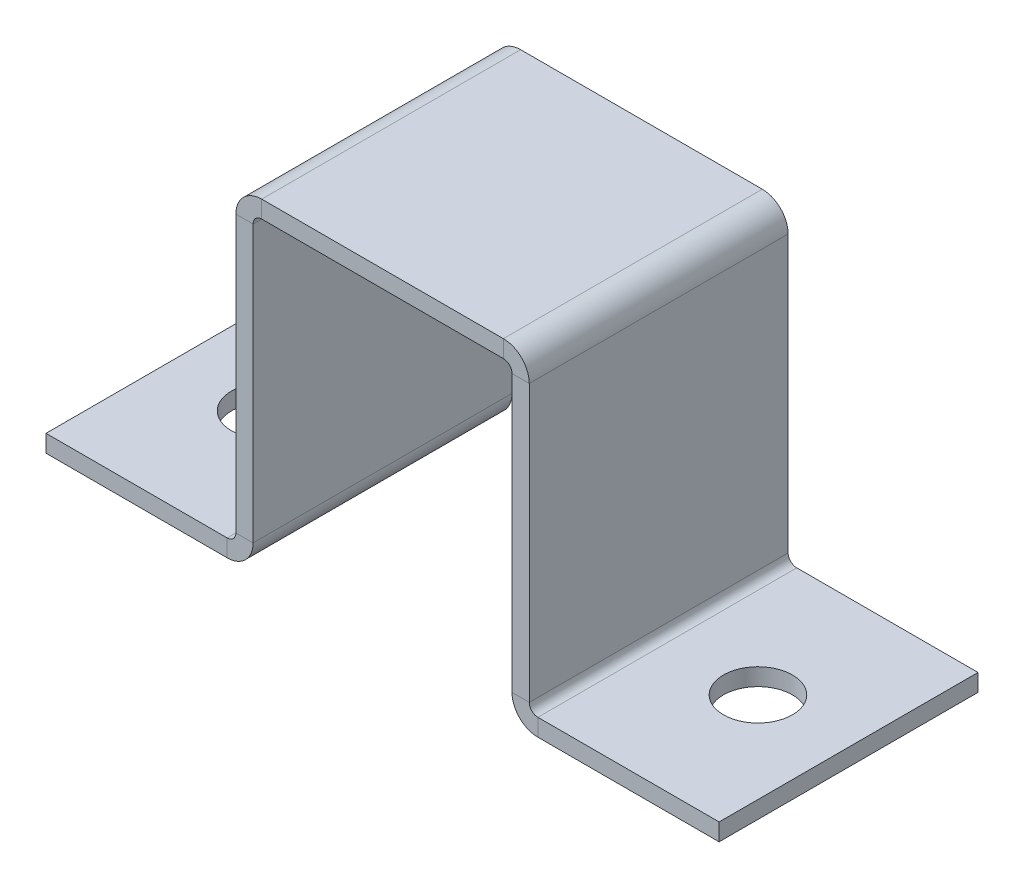
ISO-10303-21;
HEADER;
FILE_DESCRIPTION(('STEP AP214'),'2;1');
FILE_NAME('part.step','',(''),(''),'','','');
FILE_SCHEMA(('AUTOMOTIVE_DESIGN { 1 0 10303 214 1 1 1 1 }'));
ENDSEC;
DATA;
#1=APPLICATION_CONTEXT('core data for automotive mechanical design processes');
#2=APPLICATION_PROTOCOL_DEFINITION('international standard','automotive_design',2000,#1);
#3=PRODUCT_CONTEXT('',#1,'mechanical');
#4=PRODUCT('Part','Part','',(#3));
#5=PRODUCT_RELATED_PRODUCT_CATEGORY('part','',(#4));
#6=PRODUCT_DEFINITION_FORMATION('','',#4);
#7=PRODUCT_DEFINITION_CONTEXT('part definition',#1,'design');
#8=PRODUCT_DEFINITION('design','',#6,#7);
#9=PRODUCT_DEFINITION_SHAPE('','',#8);
#10=(LENGTH_UNIT() NAMED_UNIT(*) SI_UNIT(.MILLI.,.METRE.));
#11=(NAMED_UNIT(*) PLANE_ANGLE_UNIT() SI_UNIT($,.RADIAN.));
#12=(NAMED_UNIT(*) SI_UNIT($,.STERADIAN.) SOLID_ANGLE_UNIT());
#13=UNCERTAINTY_MEASURE_WITH_UNIT(LENGTH_MEASURE(1.E-05),#10,'distance_accuracy_value','');
#14=(GEOMETRIC_REPRESENTATION_CONTEXT(3) GLOBAL_UNCERTAINTY_ASSIGNED_CONTEXT((#13)) GLOBAL_UNIT_ASSIGNED_CONTEXT((#10,
#11,#12)) REPRESENTATION_CONTEXT('',''));
#15=CARTESIAN_POINT('',(0.,0.,0.));
#16=DIRECTION('',(0.,0.,1.));
#17=DIRECTION('',(1.,0.,0.));
#18=AXIS2_PLACEMENT_3D('',#15,#16,#17);
#19=CARTESIAN_POINT('',(-9.,0.,15.));
#20=DIRECTION('',(0.,0.,1.));
#21=DIRECTION('',(1.,0.,0.));
#22=AXIS2_PLACEMENT_3D('',#19,#20,#21);
#23=PLANE('',#22);
#24=DIRECTION('',(0.,1.,0.));
#25=VECTOR('',#24,1.);
#26=CARTESIAN_POINT('',(-9.,0.,15.));
#27=LINE('',#26,#25);
#28=CARTESIAN_POINT('',(-9.,0.,15.));
#29=VERTEX_POINT('',#28);
#30=CARTESIAN_POINT('',(-9.,1.,15.));
#31=VERTEX_POINT('',#30);
#32=EDGE_CURVE('E11',#29,#31,#27,.T.);
#33=ORIENTED_EDGE('',*,*,#32,.F.);
#34=CARTESIAN_POINT('',(-9.,1.5,15.));
#35=DIRECTION('',(0.,0.,-1.));
#36=DIRECTION('',(-1.,0.,0.));
#37=AXIS2_PLACEMENT_3D('',#34,#35,#36);
#38=CIRCLE('',#37,1.5);
#39=CARTESIAN_POINT('',(-7.5,1.5,15.));
#40=VERTEX_POINT('',#39);
#41=EDGE_CURVE('E366',#29,#40,#38,.F.);
#42=ORIENTED_EDGE('',*,*,#41,.T.);
#43=DIRECTION('',(1.,0.,0.));
#44=VECTOR('',#43,1.);
#45=CARTESIAN_POINT('',(-8.5,1.5,15.));
#46=LINE('',#45,#44);
#47=CARTESIAN_POINT('',(-8.5,1.5,15.));
#48=VERTEX_POINT('',#47);
#49=EDGE_CURVE('E47',#48,#40,#46,.T.);
#50=ORIENTED_EDGE('',*,*,#49,.F.);
#51=CARTESIAN_POINT('',(-9.,1.5,15.));
#52=DIRECTION('',(0.,0.,1.));
#53=DIRECTION('',(1.,0.,0.));
#54=AXIS2_PLACEMENT_3D('',#51,#52,#53);
#55=CIRCLE('',#54,0.5);
#56=EDGE_CURVE('E442',#31,#48,#55,.T.);
#57=ORIENTED_EDGE('',*,*,#56,.F.);
#58=EDGE_LOOP('',(#33,#42,#50,#57));
#59=FACE_BOUND('',#58,.T.);
#60=ADVANCED_FACE('F38',(#59),#23,.T.);
#61=CARTESIAN_POINT('',(-8.5,1.5,15.));
#62=DIRECTION('',(0.,0.,1.));
#63=DIRECTION('',(1.,0.,0.));
#64=AXIS2_PLACEMENT_3D('',#61,#62,#63);
#65=PLANE('',#64);
#66=DIRECTION('',(1.,0.,0.));
#67=VECTOR('',#66,1.);
#68=CARTESIAN_POINT('',(-19.5,0.,15.));
#69=LINE('',#68,#67);
#70=CARTESIAN_POINT('',(-19.5,0.,15.));
#71=VERTEX_POINT('',#70);
#72=EDGE_CURVE('E370',#71,#29,#69,.T.);
#73=ORIENTED_EDGE('',*,*,#72,.T.);
#74=ORIENTED_EDGE('',*,*,#32,.T.);
#75=DIRECTION('',(1.,0.,0.));
#76=VECTOR('',#75,1.);
#77=CARTESIAN_POINT('',(-19.5,1.,15.));
#78=LINE('',#77,#76);
#79=CARTESIAN_POINT('',(-19.5,1.,15.));
#80=VERTEX_POINT('',#79);
#81=EDGE_CURVE('E444',#80,#31,#78,.T.);
#82=ORIENTED_EDGE('',*,*,#81,.F.);
#83=DIRECTION('',(0.,1.,0.));
#84=VECTOR('',#83,1.);
#85=CARTESIAN_POINT('',(-19.5,0.,15.));
#86=LINE('',#85,#84);
#87=EDGE_CURVE('E447',#71,#80,#86,.T.);
#88=ORIENTED_EDGE('',*,*,#87,.F.);
#89=EDGE_LOOP('',(#73,#74,#82,#88));
#90=FACE_BOUND('',#89,.T.);
#91=ADVANCED_FACE('F453',(#90),#65,.T.);
#92=CARTESIAN_POINT('',(-7.5,1.5,0.));
#93=DIRECTION('',(0.,0.,-1.));
#94=DIRECTION('',(-1.,0.,0.));
#95=AXIS2_PLACEMENT_3D('',#92,#93,#94);
#96=PLANE('',#95);
#97=DIRECTION('',(-1.,0.,0.));
#98=VECTOR('',#97,1.);
#99=CARTESIAN_POINT('',(-7.5,1.5,0.));
#100=LINE('',#99,#98);
#101=CARTESIAN_POINT('',(-7.5,1.5,0.));
#102=VERTEX_POINT('',#101);
#103=CARTESIAN_POINT('',(-8.5,1.5,0.));
#104=VERTEX_POINT('',#103);
#105=EDGE_CURVE('E349',#102,#104,#100,.T.);
#106=ORIENTED_EDGE('',*,*,#105,.F.);
#107=CARTESIAN_POINT('',(-9.,1.5,0.));
#108=DIRECTION('',(0.,0.,-1.));
#109=DIRECTION('',(-1.,0.,0.));
#110=AXIS2_PLACEMENT_3D('',#107,#108,#109);
#111=CIRCLE('',#110,1.5);
#112=CARTESIAN_POINT('',(-9.,0.,0.));
#113=VERTEX_POINT('',#112);
#114=EDGE_CURVE('E265',#113,#102,#111,.F.);
#115=ORIENTED_EDGE('',*,*,#114,.F.);
#116=DIRECTION('',(0.,-1.,0.));
#117=VECTOR('',#116,1.);
#118=CARTESIAN_POINT('',(-9.,1.,0.));
#119=LINE('',#118,#117);
#120=CARTESIAN_POINT('',(-9.,1.,0.));
#121=VERTEX_POINT('',#120);
#122=EDGE_CURVE('E347',#121,#113,#119,.T.);
#123=ORIENTED_EDGE('',*,*,#122,.F.);
#124=CARTESIAN_POINT('',(-9.,1.5,0.));
#125=DIRECTION('',(0.,0.,1.));
#126=DIRECTION('',(1.,0.,0.));
#127=AXIS2_PLACEMENT_3D('',#124,#125,#126);
#128=CIRCLE('',#127,0.5);
#129=EDGE_CURVE('E253',#121,#104,#128,.T.);
#130=ORIENTED_EDGE('',*,*,#129,.T.);
#131=EDGE_LOOP('',(#106,#115,#123,#130));
#132=FACE_BOUND('',#131,.T.);
#133=ADVANCED_FACE('F460',(#132),#96,.T.);
#134=CARTESIAN_POINT('',(-9.,1.,0.));
#135=DIRECTION('',(0.,0.,-1.));
#136=DIRECTION('',(-1.,0.,0.));
#137=AXIS2_PLACEMENT_3D('',#134,#135,#136);
#138=PLANE('',#137);
#139=DIRECTION('',(0.,1.,0.));
#140=VECTOR('',#139,1.);
#141=CARTESIAN_POINT('',(-7.5,0.,0.));
#142=LINE('',#141,#140);
#143=CARTESIAN_POINT('',(-7.5,17.5,0.));
#144=VERTEX_POINT('',#143);
#145=EDGE_CURVE('E268',#102,#144,#142,.T.);
#146=ORIENTED_EDGE('',*,*,#145,.F.);
#147=ORIENTED_EDGE('',*,*,#105,.T.);
#148=DIRECTION('',(0.,1.,0.));
#149=VECTOR('',#148,1.);
#150=CARTESIAN_POINT('',(-8.5,0.,0.));
#151=LINE('',#150,#149);
#152=CARTESIAN_POINT('',(-8.5,17.5,0.));
#153=VERTEX_POINT('',#152);
#154=EDGE_CURVE('E250',#104,#153,#151,.T.);
#155=ORIENTED_EDGE('',*,*,#154,.T.);
#156=DIRECTION('',(1.,0.,0.));
#157=VECTOR('',#156,1.);
#158=CARTESIAN_POINT('',(-8.5,17.5,0.));
#159=LINE('',#158,#157);
#160=EDGE_CURVE('E339',#153,#144,#159,.T.);
#161=ORIENTED_EDGE('',*,*,#160,.T.);
#162=EDGE_LOOP('',(#146,#147,#155,#161));
#163=FACE_BOUND('',#162,.T.);
#164=ADVANCED_FACE('F463',(#163),#138,.T.);
#165=CARTESIAN_POINT('',(-7.5,17.5,15.));
#166=DIRECTION('',(0.,0.,1.));
#167=DIRECTION('',(1.,0.,0.));
#168=AXIS2_PLACEMENT_3D('',#165,#166,#167);
#169=PLANE('',#168);
#170=DIRECTION('',(-1.,0.,0.));
#171=VECTOR('',#170,1.);
#172=CARTESIAN_POINT('',(-7.5,17.5,15.));
#173=LINE('',#172,#171);
#174=CARTESIAN_POINT('',(-7.5,17.5,15.));
#175=VERTEX_POINT('',#174);
#176=CARTESIAN_POINT('',(-8.5,17.5,15.));
#177=VERTEX_POINT('',#176);
#178=EDGE_CURVE('E345',#175,#177,#173,.T.);
#179=ORIENTED_EDGE('',*,*,#178,.F.);
#180=CARTESIAN_POINT('',(-7.,17.5,15.));
#181=DIRECTION('',(0.,0.,1.));
#182=DIRECTION('',(1.,0.,0.));
#183=AXIS2_PLACEMENT_3D('',#180,#181,#182);
#184=CIRCLE('',#183,0.5);
#185=CARTESIAN_POINT('',(-7.,18.,15.));
#186=VERTEX_POINT('',#185);
#187=EDGE_CURVE('E378',#175,#186,#184,.F.);
#188=ORIENTED_EDGE('',*,*,#187,.T.);
#189=DIRECTION('',(0.,-1.,0.));
#190=VECTOR('',#189,1.);
#191=CARTESIAN_POINT('',(-7.,19.,15.));
#192=LINE('',#191,#190);
#193=CARTESIAN_POINT('',(-7.,19.,15.));
#194=VERTEX_POINT('',#193);
#195=EDGE_CURVE('E343',#194,#186,#192,.T.);
#196=ORIENTED_EDGE('',*,*,#195,.F.);
#197=CARTESIAN_POINT('',(-7.,17.5,15.));
#198=DIRECTION('',(0.,0.,1.));
#199=DIRECTION('',(1.,0.,0.));
#200=AXIS2_PLACEMENT_3D('',#197,#198,#199);
#201=CIRCLE('',#200,1.5);
#202=EDGE_CURVE('E438',#177,#194,#201,.F.);
#203=ORIENTED_EDGE('',*,*,#202,.F.);
#204=EDGE_LOOP('',(#179,#188,#196,#203));
#205=FACE_BOUND('',#204,.T.);
#206=ADVANCED_FACE('F483',(#205),#169,.T.);
#207=CARTESIAN_POINT('',(-7.,19.,15.));
#208=DIRECTION('',(0.,0.,1.));
#209=DIRECTION('',(1.,0.,0.));
#210=AXIS2_PLACEMENT_3D('',#207,#208,#209);
#211=PLANE('',#210);
#212=DIRECTION('',(0.,1.,0.));
#213=VECTOR('',#212,1.);
#214=CARTESIAN_POINT('',(-7.5,0.,15.));
#215=LINE('',#214,#213);
#216=EDGE_CURVE('E357',#40,#175,#215,.T.);
#217=ORIENTED_EDGE('',*,*,#216,.T.);
#218=ORIENTED_EDGE('',*,*,#178,.T.);
#219=DIRECTION('',(0.,1.,0.));
#220=VECTOR('',#219,1.);
#221=CARTESIAN_POINT('',(-8.5,0.,15.));
#222=LINE('',#221,#220);
#223=EDGE_CURVE('E360',#48,#177,#222,.T.);
#224=ORIENTED_EDGE('',*,*,#223,.F.);
#225=ORIENTED_EDGE('',*,*,#49,.T.);
#226=EDGE_LOOP('',(#217,#218,#224,#225));
#227=FACE_BOUND('',#226,.T.);
#228=ADVANCED_FACE('F355',(#227),#211,.T.);
#229=CARTESIAN_POINT('',(-7.,18.,0.));
#230=DIRECTION('',(0.,0.,-1.));
#231=DIRECTION('',(-1.,0.,0.));
#232=AXIS2_PLACEMENT_3D('',#229,#230,#231);
#233=PLANE('',#232);
#234=DIRECTION('',(0.,1.,0.));
#235=VECTOR('',#234,1.);
#236=CARTESIAN_POINT('',(-7.,18.,0.));
#237=LINE('',#236,#235);
#238=CARTESIAN_POINT('',(-7.,18.,0.));
#239=VERTEX_POINT('',#238);
#240=CARTESIAN_POINT('',(-7.,19.,0.));
#241=VERTEX_POINT('',#240);
#242=EDGE_CURVE('E341',#239,#241,#237,.T.);
#243=ORIENTED_EDGE('',*,*,#242,.F.);
#244=CARTESIAN_POINT('',(-7.,17.5,0.));
#245=DIRECTION('',(0.,0.,1.));
#246=DIRECTION('',(1.,0.,0.));
#247=AXIS2_PLACEMENT_3D('',#244,#245,#246);
#248=CIRCLE('',#247,0.5);
#249=EDGE_CURVE('E271',#144,#239,#248,.F.);
#250=ORIENTED_EDGE('',*,*,#249,.F.);
#251=ORIENTED_EDGE('',*,*,#160,.F.);
#252=CARTESIAN_POINT('',(-7.,17.5,0.));
#253=DIRECTION('',(0.,0.,1.));
#254=DIRECTION('',(1.,0.,0.));
#255=AXIS2_PLACEMENT_3D('',#252,#253,#254);
#256=CIRCLE('',#255,1.5);
#257=EDGE_CURVE('E247',#153,#241,#256,.F.);
#258=ORIENTED_EDGE('',*,*,#257,.T.);
#259=EDGE_LOOP('',(#243,#250,#251,#258));
#260=FACE_BOUND('',#259,.T.);
#261=ADVANCED_FACE('F477',(#260),#233,.T.);
#262=CARTESIAN_POINT('',(-8.5,17.5,0.));
#263=DIRECTION('',(0.,0.,-1.));
#264=DIRECTION('',(-1.,0.,0.));
#265=AXIS2_PLACEMENT_3D('',#262,#263,#264);
#266=PLANE('',#265);
#267=DIRECTION('',(1.,0.,0.));
#268=VECTOR('',#267,1.);
#269=CARTESIAN_POINT('',(-7.5,18.,0.));
#270=LINE('',#269,#268);
#271=CARTESIAN_POINT('',(6.99999999999999,18.,0.));
#272=VERTEX_POINT('',#271);
#273=EDGE_CURVE('E274',#239,#272,#270,.T.);
#274=ORIENTED_EDGE('',*,*,#273,.F.);
#275=ORIENTED_EDGE('',*,*,#242,.T.);
#276=DIRECTION('',(1.,0.,0.));
#277=VECTOR('',#276,1.);
#278=CARTESIAN_POINT('',(-7.5,19.,0.));
#279=LINE('',#278,#277);
#280=CARTESIAN_POINT('',(6.99999999999998,19.,0.));
#281=VERTEX_POINT('',#280);
#282=EDGE_CURVE('E244',#241,#281,#279,.T.);
#283=ORIENTED_EDGE('',*,*,#282,.T.);
#284=DIRECTION('',(0.,-1.,0.));
#285=VECTOR('',#284,1.);
#286=CARTESIAN_POINT('',(6.99999999999998,19.,0.));
#287=LINE('',#286,#285);
#288=EDGE_CURVE('E335',#281,#272,#287,.T.);
#289=ORIENTED_EDGE('',*,*,#288,.T.);
#290=EDGE_LOOP('',(#274,#275,#283,#289));
#291=FACE_BOUND('',#290,.T.);
#292=ADVANCED_FACE('F487',(#291),#266,.T.);
#293=CARTESIAN_POINT('',(6.99999999999999,18.,15.));
#294=DIRECTION('',(0.,0.,1.));
#295=DIRECTION('',(1.,0.,0.));
#296=AXIS2_PLACEMENT_3D('',#293,#294,#295);
#297=PLANE('',#296);
#298=DIRECTION('',(0.,1.,0.));
#299=VECTOR('',#298,1.);
#300=CARTESIAN_POINT('',(6.99999999999999,18.,15.));
#301=LINE('',#300,#299);
#302=CARTESIAN_POINT('',(6.99999999999999,18.,15.));
#303=VERTEX_POINT('',#302);
#304=CARTESIAN_POINT('',(6.99999999999998,19.,15.));
#305=VERTEX_POINT('',#304);
#306=EDGE_CURVE('E196',#303,#305,#301,.T.);
#307=ORIENTED_EDGE('',*,*,#306,.F.);
#308=CARTESIAN_POINT('',(7.,17.5,15.));
#309=DIRECTION('',(0.,0.,1.));
#310=DIRECTION('',(1.,0.,0.));
#311=AXIS2_PLACEMENT_3D('',#308,#309,#310);
#312=CIRCLE('',#311,0.5);
#313=CARTESIAN_POINT('',(7.5,17.5,15.));
#314=VERTEX_POINT('',#313);
#315=EDGE_CURVE('E200',#303,#314,#312,.F.);
#316=ORIENTED_EDGE('',*,*,#315,.T.);
#317=DIRECTION('',(-1.,0.,0.));
#318=VECTOR('',#317,1.);
#319=CARTESIAN_POINT('',(8.5,17.5,15.));
#320=LINE('',#319,#318);
#321=CARTESIAN_POINT('',(8.5,17.5,15.));
#322=VERTEX_POINT('',#321);
#323=EDGE_CURVE('E184',#322,#314,#320,.T.);
#324=ORIENTED_EDGE('',*,*,#323,.F.);
#325=CARTESIAN_POINT('',(7.,17.5,15.));
#326=DIRECTION('',(0.,0.,1.));
#327=DIRECTION('',(1.,0.,0.));
#328=AXIS2_PLACEMENT_3D('',#325,#326,#327);
#329=CIRCLE('',#328,1.5);
#330=EDGE_CURVE('E399',#305,#322,#329,.F.);
#331=ORIENTED_EDGE('',*,*,#330,.F.);
#332=EDGE_LOOP('',(#307,#316,#324,#331));
#333=FACE_BOUND('',#332,.T.);
#334=ADVANCED_FACE('F202',(#333),#297,.T.);
#335=CARTESIAN_POINT('',(8.5,17.5,15.));
#336=DIRECTION('',(0.,0.,1.));
#337=DIRECTION('',(1.,0.,0.));
#338=AXIS2_PLACEMENT_3D('',#335,#336,#337);
#339=PLANE('',#338);
#340=DIRECTION('',(1.,0.,0.));
#341=VECTOR('',#340,1.);
#342=CARTESIAN_POINT('',(-7.5,18.,15.));
#343=LINE('',#342,#341);
#344=EDGE_CURVE('E206',#186,#303,#343,.T.);
#345=ORIENTED_EDGE('',*,*,#344,.T.);
#346=ORIENTED_EDGE('',*,*,#306,.T.);
#347=DIRECTION('',(1.,0.,0.));
#348=VECTOR('',#347,1.);
#349=CARTESIAN_POINT('',(-7.5,19.,15.));
#350=LINE('',#349,#348);
#351=EDGE_CURVE('E435',#194,#305,#350,.T.);
#352=ORIENTED_EDGE('',*,*,#351,.F.);
#353=ORIENTED_EDGE('',*,*,#195,.T.);
#354=EDGE_LOOP('',(#345,#346,#352,#353));
#355=FACE_BOUND('',#354,.T.);
#356=ADVANCED_FACE('F386',(#355),#339,.T.);
#357=CARTESIAN_POINT('',(7.5,17.5,0.));
#358=DIRECTION('',(0.,0.,-1.));
#359=DIRECTION('',(-1.,0.,0.));
#360=AXIS2_PLACEMENT_3D('',#357,#358,#359);
#361=PLANE('',#360);
#362=DIRECTION('',(1.,0.,0.));
#363=VECTOR('',#362,1.);
#364=CARTESIAN_POINT('',(7.5,17.5,0.));
#365=LINE('',#364,#363);
#366=CARTESIAN_POINT('',(7.5,17.5,0.));
#367=VERTEX_POINT('',#366);
#368=CARTESIAN_POINT('',(8.5,17.5,0.));
#369=VERTEX_POINT('',#368);
#370=EDGE_CURVE('E197',#367,#369,#365,.T.);
#371=ORIENTED_EDGE('',*,*,#370,.F.);
#372=CARTESIAN_POINT('',(7.,17.5,0.));
#373=DIRECTION('',(0.,0.,1.));
#374=DIRECTION('',(1.,0.,0.));
#375=AXIS2_PLACEMENT_3D('',#372,#373,#374);
#376=CIRCLE('',#375,0.5);
#377=EDGE_CURVE('E213',#272,#367,#376,.F.);
#378=ORIENTED_EDGE('',*,*,#377,.F.);
#379=ORIENTED_EDGE('',*,*,#288,.F.);
#380=CARTESIAN_POINT('',(7.,17.5,0.));
#381=DIRECTION('',(0.,0.,1.));
#382=DIRECTION('',(1.,0.,0.));
#383=AXIS2_PLACEMENT_3D('',#380,#381,#382);
#384=CIRCLE('',#383,1.5);
#385=EDGE_CURVE('E241',#281,#369,#384,.F.);
#386=ORIENTED_EDGE('',*,*,#385,.T.);
#387=EDGE_LOOP('',(#371,#378,#379,#386));
#388=FACE_BOUND('',#387,.T.);
#389=ADVANCED_FACE('F393',(#388),#361,.T.);
#390=CARTESIAN_POINT('',(6.99999999999998,19.,0.));
#391=DIRECTION('',(0.,0.,-1.));
#392=DIRECTION('',(-1.,0.,0.));
#393=AXIS2_PLACEMENT_3D('',#390,#391,#392);
#394=PLANE('',#393);
#395=DIRECTION('',(0.,-1.,0.));
#396=VECTOR('',#395,1.);
#397=CARTESIAN_POINT('',(7.5,18.,0.));
#398=LINE('',#397,#396);
#399=CARTESIAN_POINT('',(7.5,1.5,0.));
#400=VERTEX_POINT('',#399);
#401=EDGE_CURVE('E278',#367,#400,#398,.T.);
#402=ORIENTED_EDGE('',*,*,#401,.F.);
#403=ORIENTED_EDGE('',*,*,#370,.T.);
#404=DIRECTION('',(0.,1.,0.));
#405=VECTOR('',#404,1.);
#406=CARTESIAN_POINT('',(8.5,18.,0.));
#407=LINE('',#406,#405);
#408=CARTESIAN_POINT('',(8.5,1.5,0.));
#409=VERTEX_POINT('',#408);
#410=EDGE_CURVE('E239',#369,#409,#407,.F.);
#411=ORIENTED_EDGE('',*,*,#410,.T.);
#412=DIRECTION('',(-1.,0.,0.));
#413=VECTOR('',#412,1.);
#414=CARTESIAN_POINT('',(8.5,1.5,0.));
#415=LINE('',#414,#413);
#416=EDGE_CURVE('E120',#409,#400,#415,.T.);
#417=ORIENTED_EDGE('',*,*,#416,.T.);
#418=EDGE_LOOP('',(#402,#403,#411,#417));
#419=FACE_BOUND('',#418,.T.);
#420=ADVANCED_FACE('F395',(#419),#394,.T.);
#421=CARTESIAN_POINT('',(7.5,1.5,15.));
#422=DIRECTION('',(0.,0.,1.));
#423=DIRECTION('',(1.,0.,0.));
#424=AXIS2_PLACEMENT_3D('',#421,#422,#423);
#425=PLANE('',#424);
#426=DIRECTION('',(1.,0.,0.));
#427=VECTOR('',#426,1.);
#428=CARTESIAN_POINT('',(7.5,1.5,15.));
#429=LINE('',#428,#427);
#430=CARTESIAN_POINT('',(7.5,1.5,15.));
#431=VERTEX_POINT('',#430);
#432=CARTESIAN_POINT('',(8.5,1.5,15.));
#433=VERTEX_POINT('',#432);
#434=EDGE_CURVE('E333',#431,#433,#429,.T.);
#435=ORIENTED_EDGE('',*,*,#434,.F.);
#436=CARTESIAN_POINT('',(9.,1.5,15.));
#437=DIRECTION('',(0.,0.,-1.));
#438=DIRECTION('',(-1.,0.,0.));
#439=AXIS2_PLACEMENT_3D('',#436,#437,#438);
#440=CIRCLE('',#439,1.5);
#441=CARTESIAN_POINT('',(9.,0.,15.));
#442=VERTEX_POINT('',#441);
#443=EDGE_CURVE('E221',#431,#442,#440,.F.);
#444=ORIENTED_EDGE('',*,*,#443,.T.);
#445=DIRECTION('',(0.,-1.,0.));
#446=VECTOR('',#445,1.);
#447=CARTESIAN_POINT('',(9.,1.,15.));
#448=LINE('',#447,#446);
#449=CARTESIAN_POINT('',(9.,1.,15.));
#450=VERTEX_POINT('',#449);
#451=EDGE_CURVE('E55',#450,#442,#448,.T.);
#452=ORIENTED_EDGE('',*,*,#451,.F.);
#453=CARTESIAN_POINT('',(9.,1.5,15.));
#454=DIRECTION('',(0.,0.,1.));
#455=DIRECTION('',(1.,0.,0.));
#456=AXIS2_PLACEMENT_3D('',#453,#454,#455);
#457=CIRCLE('',#456,0.5);
#458=EDGE_CURVE('E427',#433,#450,#457,.T.);
#459=ORIENTED_EDGE('',*,*,#458,.F.);
#460=EDGE_LOOP('',(#435,#444,#452,#459));
#461=FACE_BOUND('',#460,.T.);
#462=ADVANCED_FACE('F558',(#461),#425,.T.);
#463=CARTESIAN_POINT('',(9.,1.,15.));
#464=DIRECTION('',(0.,0.,1.));
#465=DIRECTION('',(1.,0.,0.));
#466=AXIS2_PLACEMENT_3D('',#463,#464,#465);
#467=PLANE('',#466);
#468=DIRECTION('',(0.,-1.,0.));
#469=VECTOR('',#468,1.);
#470=CARTESIAN_POINT('',(7.5,18.,15.));
#471=LINE('',#470,#469);
#472=EDGE_CURVE('E188',#314,#431,#471,.T.);
#473=ORIENTED_EDGE('',*,*,#472,.T.);
#474=ORIENTED_EDGE('',*,*,#434,.T.);
#475=DIRECTION('',(0.,1.,0.));
#476=VECTOR('',#475,1.);
#477=CARTESIAN_POINT('',(8.5,18.,15.));
#478=LINE('',#477,#476);
#479=EDGE_CURVE('E191',#322,#433,#478,.F.);
#480=ORIENTED_EDGE('',*,*,#479,.F.);
#481=ORIENTED_EDGE('',*,*,#323,.T.);
#482=EDGE_LOOP('',(#473,#474,#480,#481));
#483=FACE_BOUND('',#482,.T.);
#484=ADVANCED_FACE('F186',(#483),#467,.T.);
#485=CARTESIAN_POINT('',(9.,0.,0.));
#486=DIRECTION('',(0.,0.,-1.));
#487=DIRECTION('',(-1.,0.,0.));
#488=AXIS2_PLACEMENT_3D('',#485,#486,#487);
#489=PLANE('',#488);
#490=DIRECTION('',(0.,1.,0.));
#491=VECTOR('',#490,1.);
#492=CARTESIAN_POINT('',(9.,0.,0.));
#493=LINE('',#492,#491);
#494=CARTESIAN_POINT('',(9.,0.,0.));
#495=VERTEX_POINT('',#494);
#496=CARTESIAN_POINT('',(9.,1.,0.));
#497=VERTEX_POINT('',#496);
#498=EDGE_CURVE('E127',#495,#497,#493,.T.);
#499=ORIENTED_EDGE('',*,*,#498,.F.);
#500=CARTESIAN_POINT('',(9.,1.5,0.));
#501=DIRECTION('',(0.,0.,-1.));
#502=DIRECTION('',(-1.,0.,0.));
#503=AXIS2_PLACEMENT_3D('',#500,#501,#502);
#504=CIRCLE('',#503,1.5);
#505=EDGE_CURVE('E280',#400,#495,#504,.F.);
#506=ORIENTED_EDGE('',*,*,#505,.F.);
#507=ORIENTED_EDGE('',*,*,#416,.F.);
#508=CARTESIAN_POINT('',(9.,1.5,0.));
#509=DIRECTION('',(0.,0.,1.));
#510=DIRECTION('',(1.,0.,0.));
#511=AXIS2_PLACEMENT_3D('',#508,#509,#510);
#512=CIRCLE('',#511,0.5);
#513=EDGE_CURVE('E237',#409,#497,#512,.T.);
#514=ORIENTED_EDGE('',*,*,#513,.T.);
#515=EDGE_LOOP('',(#499,#506,#507,#514));
#516=FACE_BOUND('',#515,.T.);
#517=ADVANCED_FACE('F410',(#516),#489,.T.);
#518=CARTESIAN_POINT('',(8.5,1.5,0.));
#519=DIRECTION('',(0.,0.,-1.));
#520=DIRECTION('',(-1.,0.,0.));
#521=AXIS2_PLACEMENT_3D('',#518,#519,#520);
#522=PLANE('',#521);
#523=DIRECTION('',(1.,0.,0.));
#524=VECTOR('',#523,1.);
#525=CARTESIAN_POINT('',(7.5,0.,0.));
#526=LINE('',#525,#524);
#527=CARTESIAN_POINT('',(19.5,0.,0.));
#528=VERTEX_POINT('',#527);
#529=EDGE_CURVE('E227',#495,#528,#526,.T.);
#530=ORIENTED_EDGE('',*,*,#529,.F.);
#531=ORIENTED_EDGE('',*,*,#498,.T.);
#532=DIRECTION('',(1.,0.,0.));
#533=VECTOR('',#532,1.);
#534=CARTESIAN_POINT('',(7.5,1.,0.));
#535=LINE('',#534,#533);
#536=CARTESIAN_POINT('',(19.5,1.,0.));
#537=VERTEX_POINT('',#536);
#538=EDGE_CURVE('E234',#497,#537,#535,.T.);
#539=ORIENTED_EDGE('',*,*,#538,.T.);
#540=DIRECTION('',(0.,-1.,0.));
#541=VECTOR('',#540,1.);
#542=CARTESIAN_POINT('',(19.5,1.,0.));
#543=LINE('',#542,#541);
#544=EDGE_CURVE('E230',#537,#528,#543,.T.);
#545=ORIENTED_EDGE('',*,*,#544,.T.);
#546=EDGE_LOOP('',(#530,#531,#539,#545));
#547=FACE_BOUND('',#546,.T.);
#548=ADVANCED_FACE('F418',(#547),#522,.T.);
#549=CARTESIAN_POINT('',(7.5,0.,15.));
#550=DIRECTION('',(0.,1.,0.));
#551=DIRECTION('',(0.,0.,1.));
#552=AXIS2_PLACEMENT_3D('',#549,#550,#551);
#553=PLANE('',#552);
#554=CARTESIAN_POINT('',(14.25,0.,7.5));
#555=DIRECTION('',(0.,1.,0.));
#556=DIRECTION('',(0.,0.,1.));
#557=AXIS2_PLACEMENT_3D('',#554,#555,#556);
#558=CIRCLE('',#557,2.);
#559=CARTESIAN_POINT('',(14.25,0.,9.5));
#560=VERTEX_POINT('',#559);
#561=EDGE_CURVE('E231',#560,#560,#558,.T.);
#562=ORIENTED_EDGE('',*,*,#561,.T.);
#563=EDGE_LOOP('',(#562));
#564=FACE_BOUND('',#563,.T.);
#565=ORIENTED_EDGE('',*,*,#529,.T.);
#566=DIRECTION('',(0.,0.,-1.));
#567=VECTOR('',#566,1.);
#568=CARTESIAN_POINT('',(19.5,0.,15.));
#569=LINE('',#568,#567);
#570=CARTESIAN_POINT('',(19.5,0.,15.));
#571=VERTEX_POINT('',#570);
#572=EDGE_CURVE('E328',#571,#528,#569,.T.);
#573=ORIENTED_EDGE('',*,*,#572,.F.);
#574=DIRECTION('',(1.,0.,0.));
#575=VECTOR('',#574,1.);
#576=CARTESIAN_POINT('',(7.5,0.,15.));
#577=LINE('',#576,#575);
#578=EDGE_CURVE('E133',#442,#571,#577,.T.);
#579=ORIENTED_EDGE('',*,*,#578,.F.);
#580=DIRECTION('',(0.,0.,-1.));
#581=VECTOR('',#580,1.);
#582=CARTESIAN_POINT('',(9.,0.,15.));
#583=LINE('',#582,#581);
#584=EDGE_CURVE('E223',#442,#495,#583,.T.);
#585=ORIENTED_EDGE('',*,*,#584,.T.);
#586=EDGE_LOOP('',(#565,#573,#579,#585));
#587=FACE_BOUND('',#586,.T.);
#588=ADVANCED_FACE('F416',(#564,#587),#553,.F.);
#589=CARTESIAN_POINT('',(19.5,1.,15.));
#590=DIRECTION('',(1.,0.,0.));
#591=DIRECTION('',(0.,0.,-1.));
#592=AXIS2_PLACEMENT_3D('',#589,#590,#591);
#593=PLANE('',#592);
#594=ORIENTED_EDGE('',*,*,#544,.F.);
#595=DIRECTION('',(0.,0.,-1.));
#596=VECTOR('',#595,1.);
#597=CARTESIAN_POINT('',(19.5,1.,15.));
#598=LINE('',#597,#596);
#599=CARTESIAN_POINT('',(19.5,1.,15.));
#600=VERTEX_POINT('',#599);
#601=EDGE_CURVE('E326',#600,#537,#598,.T.);
#602=ORIENTED_EDGE('',*,*,#601,.F.);
#603=DIRECTION('',(0.,-1.,0.));
#604=VECTOR('',#603,1.);
#605=CARTESIAN_POINT('',(19.5,1.,15.));
#606=LINE('',#605,#604);
#607=EDGE_CURVE('E423',#600,#571,#606,.T.);
#608=ORIENTED_EDGE('',*,*,#607,.T.);
#609=ORIENTED_EDGE('',*,*,#572,.T.);
#610=EDGE_LOOP('',(#594,#602,#608,#609));
#611=FACE_BOUND('',#610,.T.);
#612=ADVANCED_FACE('F421',(#611),#593,.T.);
#613=CARTESIAN_POINT('',(7.5,1.,15.));
#614=DIRECTION('',(0.,1.,0.));
#615=DIRECTION('',(0.,0.,1.));
#616=AXIS2_PLACEMENT_3D('',#613,#614,#615);
#617=PLANE('',#616);
#618=CARTESIAN_POINT('',(14.25,1.,7.5));
#619=DIRECTION('',(0.,1.,0.));
#620=DIRECTION('',(0.,0.,1.));
#621=AXIS2_PLACEMENT_3D('',#618,#619,#620);
#622=CIRCLE('',#621,2.);
#623=CARTESIAN_POINT('',(14.25,1.,9.5));
#624=VERTEX_POINT('',#623);
#625=EDGE_CURVE('E906',#624,#624,#622,.T.);
#626=ORIENTED_EDGE('',*,*,#625,.F.);
#627=EDGE_LOOP('',(#626));
#628=FACE_BOUND('',#627,.T.);
#629=ORIENTED_EDGE('',*,*,#538,.F.);
#630=DIRECTION('',(0.,0.,-1.));
#631=VECTOR('',#630,1.);
#632=CARTESIAN_POINT('',(9.,1.,15.));
#633=LINE('',#632,#631);
#634=EDGE_CURVE('E323',#450,#497,#633,.T.);
#635=ORIENTED_EDGE('',*,*,#634,.F.);
#636=DIRECTION('',(1.,0.,0.));
#637=VECTOR('',#636,1.);
#638=CARTESIAN_POINT('',(7.5,1.,15.));
#639=LINE('',#638,#637);
#640=EDGE_CURVE('E425',#450,#600,#639,.T.);
#641=ORIENTED_EDGE('',*,*,#640,.T.);
#642=ORIENTED_EDGE('',*,*,#601,.T.);
#643=EDGE_LOOP('',(#629,#635,#641,#642));
#644=FACE_BOUND('',#643,.T.);
#645=ADVANCED_FACE('F607',(#628,#644),#617,.T.);
#646=CARTESIAN_POINT('',(9.,1.5,15.));
#647=DIRECTION('',(0.,0.,-1.));
#648=DIRECTION('',(-1.,0.,0.));
#649=AXIS2_PLACEMENT_3D('',#646,#647,#648);
#650=CYLINDRICAL_SURFACE('',#649,0.5);
#651=ORIENTED_EDGE('',*,*,#513,.F.);
#652=DIRECTION('',(0.,0.,-1.));
#653=VECTOR('',#652,1.);
#654=CARTESIAN_POINT('',(8.5,1.5,15.));
#655=LINE('',#654,#653);
#656=EDGE_CURVE('E320',#433,#409,#655,.T.);
#657=ORIENTED_EDGE('',*,*,#656,.F.);
#658=ORIENTED_EDGE('',*,*,#458,.T.);
#659=ORIENTED_EDGE('',*,*,#634,.T.);
#660=EDGE_LOOP('',(#651,#657,#658,#659));
#661=FACE_BOUND('',#660,.T.);
#662=ADVANCED_FACE('F407',(#661),#650,.F.);
#663=CARTESIAN_POINT('',(8.5,18.,15.));
#664=DIRECTION('',(1.,0.,0.));
#665=DIRECTION('',(0.,0.,-1.));
#666=AXIS2_PLACEMENT_3D('',#663,#664,#665);
#667=PLANE('',#666);
#668=ORIENTED_EDGE('',*,*,#410,.F.);
#669=DIRECTION('',(0.,0.,-1.));
#670=VECTOR('',#669,1.);
#671=CARTESIAN_POINT('',(8.5,17.5,15.));
#672=LINE('',#671,#670);
#673=EDGE_CURVE('E317',#322,#369,#672,.T.);
#674=ORIENTED_EDGE('',*,*,#673,.F.);
#675=ORIENTED_EDGE('',*,*,#479,.T.);
#676=ORIENTED_EDGE('',*,*,#656,.T.);
#677=EDGE_LOOP('',(#668,#674,#675,#676));
#678=FACE_BOUND('',#677,.T.);
#679=ADVANCED_FACE('F401',(#678),#667,.T.);
#680=CARTESIAN_POINT('',(7.,17.5,15.));
#681=DIRECTION('',(0.,0.,-1.));
#682=DIRECTION('',(-1.,0.,0.));
#683=AXIS2_PLACEMENT_3D('',#680,#681,#682);
#684=CYLINDRICAL_SURFACE('',#683,1.5);
#685=ORIENTED_EDGE('',*,*,#385,.F.);
#686=DIRECTION('',(0.,0.,-1.));
#687=VECTOR('',#686,1.);
#688=CARTESIAN_POINT('',(6.99999999999998,19.,15.));
#689=LINE('',#688,#687);
#690=EDGE_CURVE('E314',#305,#281,#689,.T.);
#691=ORIENTED_EDGE('',*,*,#690,.F.);
#692=ORIENTED_EDGE('',*,*,#330,.T.);
#693=ORIENTED_EDGE('',*,*,#673,.T.);
#694=EDGE_LOOP('',(#685,#691,#692,#693));
#695=FACE_BOUND('',#694,.T.);
#696=ADVANCED_FACE('F398',(#695),#684,.T.);
#697=CARTESIAN_POINT('',(-7.5,19.,15.));
#698=DIRECTION('',(0.,1.,0.));
#699=DIRECTION('',(0.,0.,1.));
#700=AXIS2_PLACEMENT_3D('',#697,#698,#699);
#701=PLANE('',#700);
#702=ORIENTED_EDGE('',*,*,#282,.F.);
#703=DIRECTION('',(0.,0.,-1.));
#704=VECTOR('',#703,1.);
#705=CARTESIAN_POINT('',(-7.,19.,15.));
#706=LINE('',#705,#704);
#707=EDGE_CURVE('E311',#194,#241,#706,.T.);
#708=ORIENTED_EDGE('',*,*,#707,.F.);
#709=ORIENTED_EDGE('',*,*,#351,.T.);
#710=ORIENTED_EDGE('',*,*,#690,.T.);
#711=EDGE_LOOP('',(#702,#708,#709,#710));
#712=FACE_BOUND('',#711,.T.);
#713=ADVANCED_FACE('F485',(#712),#701,.T.);
#714=CARTESIAN_POINT('',(-7.,17.5,15.));
#715=DIRECTION('',(0.,0.,-1.));
#716=DIRECTION('',(-1.,0.,0.));
#717=AXIS2_PLACEMENT_3D('',#714,#715,#716);
#718=CYLINDRICAL_SURFACE('',#717,1.5);
#719=ORIENTED_EDGE('',*,*,#257,.F.);
#720=DIRECTION('',(0.,0.,-1.));
#721=VECTOR('',#720,1.);
#722=CARTESIAN_POINT('',(-8.5,17.5,15.));
#723=LINE('',#722,#721);
#724=EDGE_CURVE('E308',#177,#153,#723,.T.);
#725=ORIENTED_EDGE('',*,*,#724,.F.);
#726=ORIENTED_EDGE('',*,*,#202,.T.);
#727=ORIENTED_EDGE('',*,*,#707,.T.);
#728=EDGE_LOOP('',(#719,#725,#726,#727));
#729=FACE_BOUND('',#728,.T.);
#730=ADVANCED_FACE('F473',(#729),#718,.T.);
#731=CARTESIAN_POINT('',(-8.5,0.,15.));
#732=DIRECTION('',(-1.,0.,0.));
#733=DIRECTION('',(0.,0.,1.));
#734=AXIS2_PLACEMENT_3D('',#731,#732,#733);
#735=PLANE('',#734);
#736=ORIENTED_EDGE('',*,*,#154,.F.);
#737=DIRECTION('',(0.,0.,-1.));
#738=VECTOR('',#737,1.);
#739=CARTESIAN_POINT('',(-8.5,1.5,15.));
#740=LINE('',#739,#738);
#741=EDGE_CURVE('E305',#48,#104,#740,.T.);
#742=ORIENTED_EDGE('',*,*,#741,.F.);
#743=ORIENTED_EDGE('',*,*,#223,.T.);
#744=ORIENTED_EDGE('',*,*,#724,.T.);
#745=EDGE_LOOP('',(#736,#742,#743,#744));
#746=FACE_BOUND('',#745,.T.);
#747=ADVANCED_FACE('F468',(#746),#735,.T.);
#748=CARTESIAN_POINT('',(-9.,1.5,15.));
#749=DIRECTION('',(0.,0.,-1.));
#750=DIRECTION('',(-1.,0.,0.));
#751=AXIS2_PLACEMENT_3D('',#748,#749,#750);
#752=CYLINDRICAL_SURFACE('',#751,0.5);
#753=ORIENTED_EDGE('',*,*,#129,.F.);
#754=DIRECTION('',(0.,0.,-1.));
#755=VECTOR('',#754,1.);
#756=CARTESIAN_POINT('',(-9.,1.,15.));
#757=LINE('',#756,#755);
#758=EDGE_CURVE('E302',#31,#121,#757,.T.);
#759=ORIENTED_EDGE('',*,*,#758,.F.);
#760=ORIENTED_EDGE('',*,*,#56,.T.);
#761=ORIENTED_EDGE('',*,*,#741,.T.);
#762=EDGE_LOOP('',(#753,#759,#760,#761));
#763=FACE_BOUND('',#762,.T.);
#764=ADVANCED_FACE('F466',(#763),#752,.F.);
#765=CARTESIAN_POINT('',(-19.5,1.,15.));
#766=DIRECTION('',(0.,1.,0.));
#767=DIRECTION('',(0.,0.,1.));
#768=AXIS2_PLACEMENT_3D('',#765,#766,#767);
#769=PLANE('',#768);
#770=CARTESIAN_POINT('',(-14.25,1.,7.5));
#771=DIRECTION('',(0.,1.,0.));
#772=DIRECTION('',(0.,0.,1.));
#773=AXIS2_PLACEMENT_3D('',#770,#771,#772);
#774=CIRCLE('',#773,2.);
#775=CARTESIAN_POINT('',(-14.25,1.,9.5));
#776=VERTEX_POINT('',#775);
#777=EDGE_CURVE('E910',#776,#776,#774,.T.);
#778=ORIENTED_EDGE('',*,*,#777,.F.);
#779=EDGE_LOOP('',(#778));
#780=FACE_BOUND('',#779,.T.);
#781=DIRECTION('',(1.,0.,0.));
#782=VECTOR('',#781,1.);
#783=CARTESIAN_POINT('',(-19.5,1.,0.));
#784=LINE('',#783,#782);
#785=CARTESIAN_POINT('',(-19.5,1.,0.));
#786=VERTEX_POINT('',#785);
#787=EDGE_CURVE('E256',#786,#121,#784,.T.);
#788=ORIENTED_EDGE('',*,*,#787,.F.);
#789=DIRECTION('',(0.,0.,-1.));
#790=VECTOR('',#789,1.);
#791=CARTESIAN_POINT('',(-19.5,1.,15.));
#792=LINE('',#791,#790);
#793=EDGE_CURVE('E300',#80,#786,#792,.T.);
#794=ORIENTED_EDGE('',*,*,#793,.F.);
#795=ORIENTED_EDGE('',*,*,#81,.T.);
#796=ORIENTED_EDGE('',*,*,#758,.T.);
#797=EDGE_LOOP('',(#788,#794,#795,#796));
#798=FACE_BOUND('',#797,.T.);
#799=ADVANCED_FACE('F673',(#780,#798),#769,.T.);
#800=CARTESIAN_POINT('',(-19.5,0.,15.));
#801=DIRECTION('',(-1.,0.,0.));
#802=DIRECTION('',(0.,0.,1.));
#803=AXIS2_PLACEMENT_3D('',#800,#801,#802);
#804=PLANE('',#803);
#805=DIRECTION('',(0.,1.,0.));
#806=VECTOR('',#805,1.);
#807=CARTESIAN_POINT('',(-19.5,0.,0.));
#808=LINE('',#807,#806);
#809=CARTESIAN_POINT('',(-19.5,0.,0.));
#810=VERTEX_POINT('',#809);
#811=EDGE_CURVE('E259',#810,#786,#808,.T.);
#812=ORIENTED_EDGE('',*,*,#811,.F.);
#813=DIRECTION('',(0.,0.,-1.));
#814=VECTOR('',#813,1.);
#815=CARTESIAN_POINT('',(-19.5,0.,15.));
#816=LINE('',#815,#814);
#817=EDGE_CURVE('E298',#71,#810,#816,.T.);
#818=ORIENTED_EDGE('',*,*,#817,.F.);
#819=ORIENTED_EDGE('',*,*,#87,.T.);
#820=ORIENTED_EDGE('',*,*,#793,.T.);
#821=EDGE_LOOP('',(#812,#818,#819,#820));
#822=FACE_BOUND('',#821,.T.);
#823=ADVANCED_FACE('F681',(#822),#804,.T.);
#824=CARTESIAN_POINT('',(-19.5,0.,15.));
#825=DIRECTION('',(0.,1.,0.));
#826=DIRECTION('',(0.,0.,1.));
#827=AXIS2_PLACEMENT_3D('',#824,#825,#826);
#828=PLANE('',#827);
#829=CARTESIAN_POINT('',(-14.25,0.,7.5));
#830=DIRECTION('',(0.,1.,0.));
#831=DIRECTION('',(0.,0.,1.));
#832=AXIS2_PLACEMENT_3D('',#829,#830,#831);
#833=CIRCLE('',#832,2.);
#834=CARTESIAN_POINT('',(-14.25,0.,9.5));
#835=VERTEX_POINT('',#834);
#836=EDGE_CURVE('E41',#835,#835,#833,.T.);
#837=ORIENTED_EDGE('',*,*,#836,.T.);
#838=EDGE_LOOP('',(#837));
#839=FACE_BOUND('',#838,.T.);
#840=DIRECTION('',(1.,0.,0.));
#841=VECTOR('',#840,1.);
#842=CARTESIAN_POINT('',(-19.5,0.,0.));
#843=LINE('',#842,#841);
#844=EDGE_CURVE('E262',#810,#113,#843,.T.);
#845=ORIENTED_EDGE('',*,*,#844,.T.);
#846=DIRECTION('',(0.,0.,-1.));
#847=VECTOR('',#846,1.);
#848=CARTESIAN_POINT('',(-9.,0.,15.));
#849=LINE('',#848,#847);
#850=EDGE_CURVE('E295',#29,#113,#849,.T.);
#851=ORIENTED_EDGE('',*,*,#850,.F.);
#852=ORIENTED_EDGE('',*,*,#72,.F.);
#853=ORIENTED_EDGE('',*,*,#817,.T.);
#854=EDGE_LOOP('',(#845,#851,#852,#853));
#855=FACE_BOUND('',#854,.T.);
#856=ADVANCED_FACE('F457',(#839,#855),#828,.F.);
#857=CARTESIAN_POINT('',(-9.,1.5,15.));
#858=DIRECTION('',(0.,0.,-1.));
#859=DIRECTION('',(-1.,0.,0.));
#860=AXIS2_PLACEMENT_3D('',#857,#858,#859);
#861=CYLINDRICAL_SURFACE('',#860,1.5);
#862=ORIENTED_EDGE('',*,*,#114,.T.);
#863=DIRECTION('',(0.,0.,-1.));
#864=VECTOR('',#863,1.);
#865=CARTESIAN_POINT('',(-7.5,1.5,15.));
#866=LINE('',#865,#864);
#867=EDGE_CURVE('E292',#40,#102,#866,.T.);
#868=ORIENTED_EDGE('',*,*,#867,.F.);
#869=ORIENTED_EDGE('',*,*,#41,.F.);
#870=ORIENTED_EDGE('',*,*,#850,.T.);
#871=EDGE_LOOP('',(#862,#868,#869,#870));
#872=FACE_BOUND('',#871,.T.);
#873=ADVANCED_FACE('F372',(#872),#861,.T.);
#874=CARTESIAN_POINT('',(-7.5,0.,15.));
#875=DIRECTION('',(-1.,0.,0.));
#876=DIRECTION('',(0.,0.,1.));
#877=AXIS2_PLACEMENT_3D('',#874,#875,#876);
#878=PLANE('',#877);
#879=ORIENTED_EDGE('',*,*,#145,.T.);
#880=DIRECTION('',(0.,0.,-1.));
#881=VECTOR('',#880,1.);
#882=CARTESIAN_POINT('',(-7.5,17.5,15.));
#883=LINE('',#882,#881);
#884=EDGE_CURVE('E289',#175,#144,#883,.T.);
#885=ORIENTED_EDGE('',*,*,#884,.F.);
#886=ORIENTED_EDGE('',*,*,#216,.F.);
#887=ORIENTED_EDGE('',*,*,#867,.T.);
#888=EDGE_LOOP('',(#879,#885,#886,#887));
#889=FACE_BOUND('',#888,.T.);
#890=ADVANCED_FACE('F376',(#889),#878,.F.);
#891=CARTESIAN_POINT('',(-7.,17.5,15.));
#892=DIRECTION('',(0.,0.,-1.));
#893=DIRECTION('',(-1.,0.,0.));
#894=AXIS2_PLACEMENT_3D('',#891,#892,#893);
#895=CYLINDRICAL_SURFACE('',#894,0.5);
#896=ORIENTED_EDGE('',*,*,#249,.T.);
#897=DIRECTION('',(0.,0.,-1.));
#898=VECTOR('',#897,1.);
#899=CARTESIAN_POINT('',(-7.,18.,15.));
#900=LINE('',#899,#898);
#901=EDGE_CURVE('E286',#186,#239,#900,.T.);
#902=ORIENTED_EDGE('',*,*,#901,.F.);
#903=ORIENTED_EDGE('',*,*,#187,.F.);
#904=ORIENTED_EDGE('',*,*,#884,.T.);
#905=EDGE_LOOP('',(#896,#902,#903,#904));
#906=FACE_BOUND('',#905,.T.);
#907=ADVANCED_FACE('F480',(#906),#895,.F.);
#908=CARTESIAN_POINT('',(-7.5,18.,15.));
#909=DIRECTION('',(0.,1.,0.));
#910=DIRECTION('',(0.,0.,1.));
#911=AXIS2_PLACEMENT_3D('',#908,#909,#910);
#912=PLANE('',#911);
#913=ORIENTED_EDGE('',*,*,#273,.T.);
#914=DIRECTION('',(0.,0.,-1.));
#915=VECTOR('',#914,1.);
#916=CARTESIAN_POINT('',(6.99999999999999,18.,15.));
#917=LINE('',#916,#915);
#918=EDGE_CURVE('E215',#303,#272,#917,.T.);
#919=ORIENTED_EDGE('',*,*,#918,.F.);
#920=ORIENTED_EDGE('',*,*,#344,.F.);
#921=ORIENTED_EDGE('',*,*,#901,.T.);
#922=EDGE_LOOP('',(#913,#919,#920,#921));
#923=FACE_BOUND('',#922,.T.);
#924=ADVANCED_FACE('F390',(#923),#912,.F.);
#925=CARTESIAN_POINT('',(7.,17.5,15.));
#926=DIRECTION('',(0.,0.,-1.));
#927=DIRECTION('',(-1.,0.,0.));
#928=AXIS2_PLACEMENT_3D('',#925,#926,#927);
#929=CYLINDRICAL_SURFACE('',#928,0.5);
#930=ORIENTED_EDGE('',*,*,#377,.T.);
#931=DIRECTION('',(0.,0.,-1.));
#932=VECTOR('',#931,1.);
#933=CARTESIAN_POINT('',(7.5,17.5,15.));
#934=LINE('',#933,#932);
#935=EDGE_CURVE('E210',#314,#367,#934,.T.);
#936=ORIENTED_EDGE('',*,*,#935,.F.);
#937=ORIENTED_EDGE('',*,*,#315,.F.);
#938=ORIENTED_EDGE('',*,*,#918,.T.);
#939=EDGE_LOOP('',(#930,#936,#937,#938));
#940=FACE_BOUND('',#939,.T.);
#941=ADVANCED_FACE('F211',(#940),#929,.F.);
#942=CARTESIAN_POINT('',(7.5,18.,15.));
#943=DIRECTION('',(1.,0.,0.));
#944=DIRECTION('',(0.,0.,-1.));
#945=AXIS2_PLACEMENT_3D('',#942,#943,#944);
#946=PLANE('',#945);
#947=ORIENTED_EDGE('',*,*,#401,.T.);
#948=DIRECTION('',(0.,0.,-1.));
#949=VECTOR('',#948,1.);
#950=CARTESIAN_POINT('',(7.5,1.5,15.));
#951=LINE('',#950,#949);
#952=EDGE_CURVE('E216',#431,#400,#951,.T.);
#953=ORIENTED_EDGE('',*,*,#952,.F.);
#954=ORIENTED_EDGE('',*,*,#472,.F.);
#955=ORIENTED_EDGE('',*,*,#935,.T.);
#956=EDGE_LOOP('',(#947,#953,#954,#955));
#957=FACE_BOUND('',#956,.T.);
#958=ADVANCED_FACE('F218',(#957),#946,.F.);
#959=CARTESIAN_POINT('',(9.,1.5,15.));
#960=DIRECTION('',(0.,0.,-1.));
#961=DIRECTION('',(-1.,0.,0.));
#962=AXIS2_PLACEMENT_3D('',#959,#960,#961);
#963=CYLINDRICAL_SURFACE('',#962,1.5);
#964=ORIENTED_EDGE('',*,*,#505,.T.);
#965=ORIENTED_EDGE('',*,*,#584,.F.);
#966=ORIENTED_EDGE('',*,*,#443,.F.);
#967=ORIENTED_EDGE('',*,*,#952,.T.);
#968=EDGE_LOOP('',(#964,#965,#966,#967));
#969=FACE_BOUND('',#968,.T.);
#970=ADVANCED_FACE('F413',(#969),#963,.T.);
#971=CARTESIAN_POINT('',(9.,1.5,15.));
#972=DIRECTION('',(0.,0.,1.));
#973=DIRECTION('',(1.,0.,0.));
#974=AXIS2_PLACEMENT_3D('',#971,#972,#973);
#975=PLANE('',#974);
#976=ORIENTED_EDGE('',*,*,#578,.T.);
#977=ORIENTED_EDGE('',*,*,#607,.F.);
#978=ORIENTED_EDGE('',*,*,#640,.F.);
#979=ORIENTED_EDGE('',*,*,#451,.T.);
#980=EDGE_LOOP('',(#976,#977,#978,#979));
#981=FACE_BOUND('',#980,.T.);
#982=ADVANCED_FACE('F752',(#981),#975,.T.);
#983=CARTESIAN_POINT('',(9.,1.5,0.));
#984=DIRECTION('',(0.,0.,1.));
#985=DIRECTION('',(1.,0.,0.));
#986=AXIS2_PLACEMENT_3D('',#983,#984,#985);
#987=PLANE('',#986);
#988=ORIENTED_EDGE('',*,*,#787,.T.);
#989=ORIENTED_EDGE('',*,*,#122,.T.);
#990=ORIENTED_EDGE('',*,*,#844,.F.);
#991=ORIENTED_EDGE('',*,*,#811,.T.);
#992=EDGE_LOOP('',(#988,#989,#990,#991));
#993=FACE_BOUND('',#992,.T.);
#994=ADVANCED_FACE('F762',(#993),#987,.F.);
#995=CARTESIAN_POINT('',(-14.25,-9.,7.5));
#996=DIRECTION('',(0.,1.,0.));
#997=DIRECTION('',(0.,0.,1.));
#998=AXIS2_PLACEMENT_3D('',#995,#996,#997);
#999=CYLINDRICAL_SURFACE('',#998,2.);
#1000=ORIENTED_EDGE('',*,*,#777,.T.);
#1001=EDGE_LOOP('',(#1000));
#1002=FACE_BOUND('',#1001,.T.);
#1003=ORIENTED_EDGE('',*,*,#836,.F.);
#1004=EDGE_LOOP('',(#1003));
#1005=FACE_BOUND('',#1004,.T.);
#1006=ADVANCED_FACE('F772',(#1002,#1005),#999,.F.);
#1007=CARTESIAN_POINT('',(14.25,-9.,7.5));
#1008=DIRECTION('',(0.,1.,0.));
#1009=DIRECTION('',(0.,0.,1.));
#1010=AXIS2_PLACEMENT_3D('',#1007,#1008,#1009);
#1011=CYLINDRICAL_SURFACE('',#1010,2.);
#1012=ORIENTED_EDGE('',*,*,#625,.T.);
#1013=EDGE_LOOP('',(#1012));
#1014=FACE_BOUND('',#1013,.T.);
#1015=ORIENTED_EDGE('',*,*,#561,.F.);
#1016=EDGE_LOOP('',(#1015));
#1017=FACE_BOUND('',#1016,.T.);
#1018=ADVANCED_FACE('F815',(#1014,#1017),#1011,.F.);
#1019=CLOSED_SHELL('',(#60,#91,#133,#164,#206,#228,#261,#292,#334,#356,#389,#420,#462,#484,#517,
#548,#588,#612,#645,#662,#679,#696,#713,#730,#747,#764,#799,#823,#856,#873,#890,#907,#924,#941,
#958,#970,#982,#994,#1006,#1018));
#1020=MANIFOLD_SOLID_BREP('B2',#1019);
#1021=ADVANCED_BREP_SHAPE_REPRESENTATION('',(#18,#1020),#14);
#1022=SHAPE_DEFINITION_REPRESENTATION(#9,#1021);
ENDSEC;
END-ISO-10303-21;
